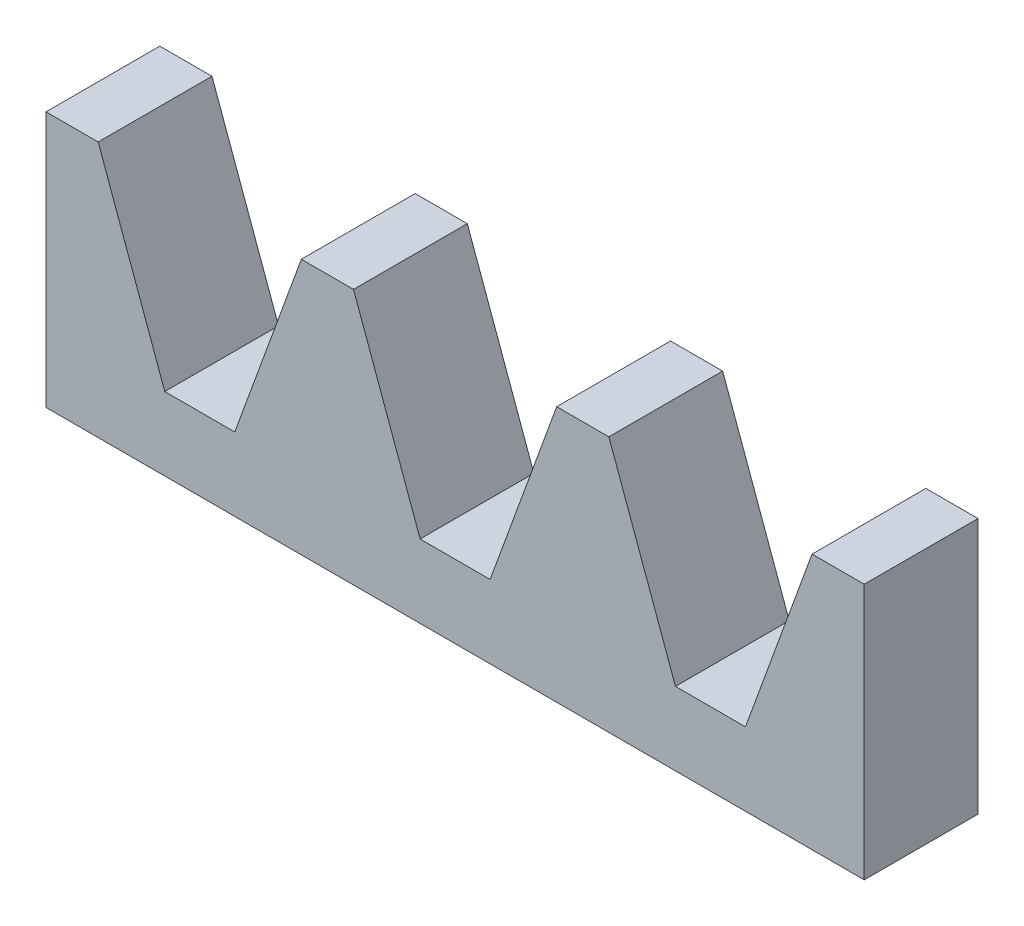
ISO-10303-21;
HEADER;
FILE_DESCRIPTION(('STEP AP214'),'2;1');
FILE_NAME('part.step','',(''),(''),'','','');
FILE_SCHEMA(('AUTOMOTIVE_DESIGN { 1 0 10303 214 1 1 1 1 }'));
ENDSEC;
DATA;
#1=APPLICATION_CONTEXT('core data for automotive mechanical design processes');
#2=APPLICATION_PROTOCOL_DEFINITION('international standard','automotive_design',2000,#1);
#3=PRODUCT_CONTEXT('',#1,'mechanical');
#4=PRODUCT('Part','Part','',(#3));
#5=PRODUCT_RELATED_PRODUCT_CATEGORY('part','',(#4));
#6=PRODUCT_DEFINITION_FORMATION('','',#4);
#7=PRODUCT_DEFINITION_CONTEXT('part definition',#1,'design');
#8=PRODUCT_DEFINITION('design','',#6,#7);
#9=PRODUCT_DEFINITION_SHAPE('','',#8);
#10=(LENGTH_UNIT() NAMED_UNIT(*) SI_UNIT(.MILLI.,.METRE.));
#11=(NAMED_UNIT(*) PLANE_ANGLE_UNIT() SI_UNIT($,.RADIAN.));
#12=(NAMED_UNIT(*) SI_UNIT($,.STERADIAN.) SOLID_ANGLE_UNIT());
#13=UNCERTAINTY_MEASURE_WITH_UNIT(LENGTH_MEASURE(1.E-05),#10,'distance_accuracy_value','');
#14=(GEOMETRIC_REPRESENTATION_CONTEXT(3) GLOBAL_UNCERTAINTY_ASSIGNED_CONTEXT((#13)) GLOBAL_UNIT_ASSIGNED_CONTEXT((#10,
#11,#12)) REPRESENTATION_CONTEXT('',''));
#15=CARTESIAN_POINT('',(0.,0.,0.));
#16=DIRECTION('',(0.,0.,1.));
#17=DIRECTION('',(1.,0.,0.));
#18=AXIS2_PLACEMENT_3D('',#15,#16,#17);
#19=CARTESIAN_POINT('',(0.,6.3,-2.8));
#20=DIRECTION('',(0.,1.,0.));
#21=DIRECTION('',(0.,0.,1.));
#22=AXIS2_PLACEMENT_3D('',#19,#20,#21);
#23=PLANE('',#22);
#24=DIRECTION('',(0.,0.,1.));
#25=VECTOR('',#24,1.);
#26=CARTESIAN_POINT('',(16.3498191064676,6.3,-2.8));
#27=LINE('',#26,#25);
#28=CARTESIAN_POINT('',(16.3498191064676,6.3,-2.8));
#29=VERTEX_POINT('',#28);
#30=CARTESIAN_POINT('',(16.3498191064676,6.3,0.));
#31=VERTEX_POINT('',#30);
#32=EDGE_CURVE('E254',#29,#31,#27,.T.);
#33=ORIENTED_EDGE('',*,*,#32,.F.);
#34=DIRECTION('',(-1.,0.,0.));
#35=VECTOR('',#34,1.);
#36=CARTESIAN_POINT('',(0.,6.3,-2.8));
#37=LINE('',#36,#35);
#38=CARTESIAN_POINT('',(15.0661073935324,6.3,-2.8));
#39=VERTEX_POINT('',#38);
#40=EDGE_CURVE('E184',#29,#39,#37,.T.);
#41=ORIENTED_EDGE('',*,*,#40,.T.);
#42=DIRECTION('',(0.,0.,-1.));
#43=VECTOR('',#42,1.);
#44=CARTESIAN_POINT('',(15.0661073935324,6.3,-2.8));
#45=LINE('',#44,#43);
#46=CARTESIAN_POINT('',(15.0661073935324,6.3,0.));
#47=VERTEX_POINT('',#46);
#48=EDGE_CURVE('E242',#47,#39,#45,.T.);
#49=ORIENTED_EDGE('',*,*,#48,.F.);
#50=DIRECTION('',(-1.,0.,0.));
#51=VECTOR('',#50,1.);
#52=CARTESIAN_POINT('',(0.,6.3,0.));
#53=LINE('',#52,#51);
#54=EDGE_CURVE('E176',#31,#47,#53,.T.);
#55=ORIENTED_EDGE('',*,*,#54,.F.);
#56=EDGE_LOOP('',(#33,#41,#49,#55));
#57=FACE_BOUND('',#56,.T.);
#58=ADVANCED_FACE('F32',(#57),#23,.T.);
#59=DIRECTION('',(0.,0.,1.));
#60=VECTOR('',#59,1.);
#61=CARTESIAN_POINT('',(10.0666338064676,6.3,-2.8));
#62=LINE('',#61,#60);
#63=CARTESIAN_POINT('',(10.0666338064676,6.3,-2.8));
#64=VERTEX_POINT('',#63);
#65=CARTESIAN_POINT('',(10.0666338064676,6.3,0.));
#66=VERTEX_POINT('',#65);
#67=EDGE_CURVE('E203',#64,#66,#62,.T.);
#68=ORIENTED_EDGE('',*,*,#67,.F.);
#69=CARTESIAN_POINT('',(8.78292209353239,6.3,-2.8));
#70=VERTEX_POINT('',#69);
#71=EDGE_CURVE('E174',#64,#70,#37,.T.);
#72=ORIENTED_EDGE('',*,*,#71,.T.);
#73=DIRECTION('',(0.,0.,-1.));
#74=VECTOR('',#73,1.);
#75=CARTESIAN_POINT('',(8.78292209353239,6.3,-2.8));
#76=LINE('',#75,#74);
#77=CARTESIAN_POINT('',(8.78292209353239,6.3,0.));
#78=VERTEX_POINT('',#77);
#79=EDGE_CURVE('E206',#78,#70,#76,.T.);
#80=ORIENTED_EDGE('',*,*,#79,.F.);
#81=EDGE_CURVE('E194',#66,#78,#53,.T.);
#82=ORIENTED_EDGE('',*,*,#81,.F.);
#83=EDGE_LOOP('',(#68,#72,#80,#82));
#84=FACE_BOUND('',#83,.T.);
#85=ADVANCED_FACE('F202',(#84),#23,.T.);
#86=DIRECTION('',(0.,0.,1.));
#87=VECTOR('',#86,1.);
#88=CARTESIAN_POINT('',(3.78344850646761,6.3,-2.8));
#89=LINE('',#88,#87);
#90=CARTESIAN_POINT('',(3.78344850646761,6.3,-2.8));
#91=VERTEX_POINT('',#90);
#92=CARTESIAN_POINT('',(3.78344850646761,6.3,0.));
#93=VERTEX_POINT('',#92);
#94=EDGE_CURVE('E219',#91,#93,#89,.T.);
#95=ORIENTED_EDGE('',*,*,#94,.F.);
#96=CARTESIAN_POINT('',(2.49973679353239,6.3,-2.8));
#97=VERTEX_POINT('',#96);
#98=EDGE_CURVE('E170',#91,#97,#37,.T.);
#99=ORIENTED_EDGE('',*,*,#98,.T.);
#100=DIRECTION('',(0.,0.,-1.));
#101=VECTOR('',#100,1.);
#102=CARTESIAN_POINT('',(2.49973679353239,6.3,-2.8));
#103=LINE('',#102,#101);
#104=CARTESIAN_POINT('',(2.49973679353239,6.3,0.));
#105=VERTEX_POINT('',#104);
#106=EDGE_CURVE('E180',#105,#97,#103,.T.);
#107=ORIENTED_EDGE('',*,*,#106,.F.);
#108=EDGE_CURVE('E178',#93,#105,#53,.T.);
#109=ORIENTED_EDGE('',*,*,#108,.F.);
#110=EDGE_LOOP('',(#95,#99,#107,#109));
#111=FACE_BOUND('',#110,.T.);
#112=ADVANCED_FACE('F216',(#111),#23,.T.);
#113=DIRECTION('',(0.,0.,1.));
#114=VECTOR('',#113,1.);
#115=CARTESIAN_POINT('',(22.6330044064676,6.3,-2.8));
#116=LINE('',#115,#114);
#117=CARTESIAN_POINT('',(22.6330044064676,6.3,-2.8));
#118=VERTEX_POINT('',#117);
#119=CARTESIAN_POINT('',(22.6330044064676,6.3,0.));
#120=VERTEX_POINT('',#119);
#121=EDGE_CURVE('E157',#118,#120,#116,.T.);
#122=ORIENTED_EDGE('',*,*,#121,.F.);
#123=CARTESIAN_POINT('',(21.3492926935324,6.3,-2.8));
#124=VERTEX_POINT('',#123);
#125=EDGE_CURVE('E166',#118,#124,#37,.T.);
#126=ORIENTED_EDGE('',*,*,#125,.T.);
#127=DIRECTION('',(0.,0.,-1.));
#128=VECTOR('',#127,1.);
#129=CARTESIAN_POINT('',(21.3492926935324,6.3,-2.8));
#130=LINE('',#129,#128);
#131=CARTESIAN_POINT('',(21.3492926935324,6.3,0.));
#132=VERTEX_POINT('',#131);
#133=EDGE_CURVE('E263',#132,#124,#130,.T.);
#134=ORIENTED_EDGE('',*,*,#133,.F.);
#135=EDGE_CURVE('E171',#120,#132,#53,.T.);
#136=ORIENTED_EDGE('',*,*,#135,.F.);
#137=EDGE_LOOP('',(#122,#126,#134,#136));
#138=FACE_BOUND('',#137,.T.);
#139=ADVANCED_FACE('F298',(#138),#23,.T.);
#140=CARTESIAN_POINT('',(0.,0.,-2.8));
#141=DIRECTION('',(0.,-1.,0.));
#142=DIRECTION('',(0.,0.,-1.));
#143=AXIS2_PLACEMENT_3D('',#140,#141,#142);
#144=PLANE('',#143);
#145=DIRECTION('',(0.,0.,1.));
#146=VECTOR('',#145,1.);
#147=CARTESIAN_POINT('',(22.6330044064676,0.,-2.8));
#148=LINE('',#147,#146);
#149=CARTESIAN_POINT('',(22.6330044064676,0.,-2.8));
#150=VERTEX_POINT('',#149);
#151=CARTESIAN_POINT('',(22.6330044064676,0.,0.));
#152=VERTEX_POINT('',#151);
#153=EDGE_CURVE('E146',#150,#152,#148,.T.);
#154=ORIENTED_EDGE('',*,*,#153,.T.);
#155=DIRECTION('',(1.,0.,0.));
#156=VECTOR('',#155,1.);
#157=CARTESIAN_POINT('',(0.,0.,0.));
#158=LINE('',#157,#156);
#159=CARTESIAN_POINT('',(2.49973679353239,0.,0.));
#160=VERTEX_POINT('',#159);
#161=EDGE_CURVE('E185',#160,#152,#158,.T.);
#162=ORIENTED_EDGE('',*,*,#161,.F.);
#163=DIRECTION('',(0.,0.,1.));
#164=VECTOR('',#163,1.);
#165=CARTESIAN_POINT('',(2.49973679353239,0.,-2.8));
#166=LINE('',#165,#164);
#167=CARTESIAN_POINT('',(2.49973679353239,0.,-2.8));
#168=VERTEX_POINT('',#167);
#169=EDGE_CURVE('E169',#168,#160,#166,.T.);
#170=ORIENTED_EDGE('',*,*,#169,.F.);
#171=DIRECTION('',(1.,0.,0.));
#172=VECTOR('',#171,1.);
#173=CARTESIAN_POINT('',(0.,0.,-2.8));
#174=LINE('',#173,#172);
#175=EDGE_CURVE('E164',#168,#150,#174,.T.);
#176=ORIENTED_EDGE('',*,*,#175,.T.);
#177=EDGE_LOOP('',(#154,#162,#170,#176));
#178=FACE_BOUND('',#177,.T.);
#179=ADVANCED_FACE('F34',(#178),#144,.T.);
#180=CARTESIAN_POINT('',(0.,6.3,-2.8));
#181=DIRECTION('',(0.,0.,-1.));
#182=DIRECTION('',(-1.,0.,0.));
#183=AXIS2_PLACEMENT_3D('',#180,#181,#182);
#184=PLANE('',#183);
#185=DIRECTION('',(0.,-1.,0.));
#186=VECTOR('',#185,1.);
#187=CARTESIAN_POINT('',(22.6330044064676,6.3,-2.8));
#188=LINE('',#187,#186);
#189=EDGE_CURVE('E149',#118,#150,#188,.T.);
#190=ORIENTED_EDGE('',*,*,#189,.T.);
#191=ORIENTED_EDGE('',*,*,#175,.F.);
#192=DIRECTION('',(0.,1.,0.));
#193=VECTOR('',#192,1.);
#194=CARTESIAN_POINT('',(2.49973679353239,0.,-2.8));
#195=LINE('',#194,#193);
#196=EDGE_CURVE('E284',#168,#97,#195,.T.);
#197=ORIENTED_EDGE('',*,*,#196,.T.);
#198=ORIENTED_EDGE('',*,*,#98,.F.);
#199=DIRECTION('',(0.342020143325663,-0.93969262078591,0.));
#200=VECTOR('',#199,1.);
#201=CARTESIAN_POINT('',(3.77420366251725,6.3254,-2.8));
#202=LINE('',#201,#200);
#203=CARTESIAN_POINT('',(5.42131456066549,1.8,-2.8));
#204=VERTEX_POINT('',#203);
#205=EDGE_CURVE('E230',#91,#204,#202,.T.);
#206=ORIENTED_EDGE('',*,*,#205,.T.);
#207=DIRECTION('',(1.,0.,0.));
#208=VECTOR('',#207,1.);
#209=CARTESIAN_POINT('',(7.14505603933451,1.8,-2.8));
#210=LINE('',#209,#208);
#211=CARTESIAN_POINT('',(7.14505603933451,1.8,-2.8));
#212=VERTEX_POINT('',#211);
#213=EDGE_CURVE('E236',#204,#212,#210,.T.);
#214=ORIENTED_EDGE('',*,*,#213,.T.);
#215=DIRECTION('',(0.342020143325663,0.93969262078591,0.));
#216=VECTOR('',#215,1.);
#217=CARTESIAN_POINT('',(8.79216693748275,6.3254,-2.8));
#218=LINE('',#217,#216);
#219=EDGE_CURVE('E226',#212,#70,#218,.T.);
#220=ORIENTED_EDGE('',*,*,#219,.T.);
#221=ORIENTED_EDGE('',*,*,#71,.F.);
#222=DIRECTION('',(0.342020143325663,-0.93969262078591,0.));
#223=VECTOR('',#222,1.);
#224=CARTESIAN_POINT('',(10.0573889625173,6.3254,-2.8));
#225=LINE('',#224,#223);
#226=CARTESIAN_POINT('',(11.7044998606655,1.8,-2.8));
#227=VERTEX_POINT('',#226);
#228=EDGE_CURVE('E252',#64,#227,#225,.T.);
#229=ORIENTED_EDGE('',*,*,#228,.T.);
#230=DIRECTION('',(1.,0.,0.));
#231=VECTOR('',#230,1.);
#232=CARTESIAN_POINT('',(13.4282413393345,1.8,-2.8));
#233=LINE('',#232,#231);
#234=CARTESIAN_POINT('',(13.4282413393345,1.8,-2.8));
#235=VERTEX_POINT('',#234);
#236=EDGE_CURVE('E257',#227,#235,#233,.T.);
#237=ORIENTED_EDGE('',*,*,#236,.T.);
#238=DIRECTION('',(0.342020143325663,0.93969262078591,0.));
#239=VECTOR('',#238,1.);
#240=CARTESIAN_POINT('',(15.0753522374828,6.3254,-2.8));
#241=LINE('',#240,#239);
#242=EDGE_CURVE('E247',#235,#39,#241,.T.);
#243=ORIENTED_EDGE('',*,*,#242,.T.);
#244=ORIENTED_EDGE('',*,*,#40,.F.);
#245=DIRECTION('',(0.342020143325663,-0.93969262078591,0.));
#246=VECTOR('',#245,1.);
#247=CARTESIAN_POINT('',(16.3405742625173,6.3254,-2.8));
#248=LINE('',#247,#246);
#249=CARTESIAN_POINT('',(17.9876851606655,1.8,-2.8));
#250=VERTEX_POINT('',#249);
#251=EDGE_CURVE('E273',#29,#250,#248,.T.);
#252=ORIENTED_EDGE('',*,*,#251,.T.);
#253=DIRECTION('',(1.,0.,0.));
#254=VECTOR('',#253,1.);
#255=CARTESIAN_POINT('',(19.7114266393345,1.8,-2.8));
#256=LINE('',#255,#254);
#257=CARTESIAN_POINT('',(19.7114266393345,1.8,-2.8));
#258=VERTEX_POINT('',#257);
#259=EDGE_CURVE('E277',#250,#258,#256,.T.);
#260=ORIENTED_EDGE('',*,*,#259,.T.);
#261=DIRECTION('',(0.342020143325663,0.93969262078591,0.));
#262=VECTOR('',#261,1.);
#263=CARTESIAN_POINT('',(21.3585375374828,6.3254,-2.8));
#264=LINE('',#263,#262);
#265=EDGE_CURVE('E268',#258,#124,#264,.T.);
#266=ORIENTED_EDGE('',*,*,#265,.T.);
#267=ORIENTED_EDGE('',*,*,#125,.F.);
#268=EDGE_LOOP('',(#190,#191,#197,#198,#206,#214,#220,#221,#229,#237,#243,#244,#252,#260,#266,#267));
#269=FACE_BOUND('',#268,.T.);
#270=ADVANCED_FACE('F162',(#269),#184,.T.);
#271=CARTESIAN_POINT('',(0.,6.3,0.));
#272=DIRECTION('',(0.,0.,-1.));
#273=DIRECTION('',(-1.,0.,0.));
#274=AXIS2_PLACEMENT_3D('',#271,#272,#273);
#275=PLANE('',#274);
#276=ORIENTED_EDGE('',*,*,#161,.T.);
#277=DIRECTION('',(0.,-1.,0.));
#278=VECTOR('',#277,1.);
#279=CARTESIAN_POINT('',(22.6330044064676,6.3,0.));
#280=LINE('',#279,#278);
#281=EDGE_CURVE('E152',#120,#152,#280,.T.);
#282=ORIENTED_EDGE('',*,*,#281,.F.);
#283=ORIENTED_EDGE('',*,*,#135,.T.);
#284=DIRECTION('',(0.342020143325663,0.93969262078591,0.));
#285=VECTOR('',#284,1.);
#286=CARTESIAN_POINT('',(21.3585375374828,6.3254,0.));
#287=LINE('',#286,#285);
#288=CARTESIAN_POINT('',(19.7114266393345,1.8,0.));
#289=VERTEX_POINT('',#288);
#290=EDGE_CURVE('E270',#289,#132,#287,.T.);
#291=ORIENTED_EDGE('',*,*,#290,.F.);
#292=DIRECTION('',(1.,0.,0.));
#293=VECTOR('',#292,1.);
#294=CARTESIAN_POINT('',(19.7114266393345,1.8,0.));
#295=LINE('',#294,#293);
#296=CARTESIAN_POINT('',(17.9876851606655,1.8,0.));
#297=VERTEX_POINT('',#296);
#298=EDGE_CURVE('E274',#297,#289,#295,.T.);
#299=ORIENTED_EDGE('',*,*,#298,.F.);
#300=DIRECTION('',(-0.342020143325663,0.939692620785911,0.));
#301=VECTOR('',#300,1.);
#302=CARTESIAN_POINT('',(14.4372535894889,11.5547305711267,0.));
#303=LINE('',#302,#301);
#304=EDGE_CURVE('E11',#297,#31,#303,.T.);
#305=ORIENTED_EDGE('',*,*,#304,.T.);
#306=ORIENTED_EDGE('',*,*,#54,.T.);
#307=DIRECTION('',(0.342020143325663,0.93969262078591,0.));
#308=VECTOR('',#307,1.);
#309=CARTESIAN_POINT('',(15.0753522374828,6.3254,0.));
#310=LINE('',#309,#308);
#311=CARTESIAN_POINT('',(13.4282413393345,1.8,0.));
#312=VERTEX_POINT('',#311);
#313=EDGE_CURVE('E249',#312,#47,#310,.T.);
#314=ORIENTED_EDGE('',*,*,#313,.F.);
#315=DIRECTION('',(1.,0.,0.));
#316=VECTOR('',#315,1.);
#317=CARTESIAN_POINT('',(13.4282413393345,1.8,0.));
#318=LINE('',#317,#316);
#319=CARTESIAN_POINT('',(11.7044998606655,1.8,0.));
#320=VERTEX_POINT('',#319);
#321=EDGE_CURVE('E197',#320,#312,#318,.T.);
#322=ORIENTED_EDGE('',*,*,#321,.F.);
#323=DIRECTION('',(-0.342020143325663,0.939692620785911,0.));
#324=VECTOR('',#323,1.);
#325=CARTESIAN_POINT('',(8.88906134741293,9.53535374102447,0.));
#326=LINE('',#325,#324);
#327=EDGE_CURVE('E40',#320,#66,#326,.T.);
#328=ORIENTED_EDGE('',*,*,#327,.T.);
#329=ORIENTED_EDGE('',*,*,#81,.T.);
#330=DIRECTION('',(0.342020143325663,0.93969262078591,0.));
#331=VECTOR('',#330,1.);
#332=CARTESIAN_POINT('',(8.79216693748275,6.3254,0.));
#333=LINE('',#332,#331);
#334=CARTESIAN_POINT('',(7.14505603933451,1.8,0.));
#335=VERTEX_POINT('',#334);
#336=EDGE_CURVE('E228',#335,#78,#333,.T.);
#337=ORIENTED_EDGE('',*,*,#336,.F.);
#338=DIRECTION('',(1.,0.,0.));
#339=VECTOR('',#338,1.);
#340=CARTESIAN_POINT('',(7.14505603933451,1.8,0.));
#341=LINE('',#340,#339);
#342=CARTESIAN_POINT('',(5.42131456066549,1.8,0.));
#343=VERTEX_POINT('',#342);
#344=EDGE_CURVE('E231',#343,#335,#341,.T.);
#345=ORIENTED_EDGE('',*,*,#344,.F.);
#346=DIRECTION('',(-0.342020143325663,0.939692620785911,0.));
#347=VECTOR('',#346,1.);
#348=CARTESIAN_POINT('',(3.34086910533698,7.51597691092219,0.));
#349=LINE('',#348,#347);
#350=EDGE_CURVE('E183',#343,#93,#349,.T.);
#351=ORIENTED_EDGE('',*,*,#350,.T.);
#352=ORIENTED_EDGE('',*,*,#108,.T.);
#353=DIRECTION('',(0.,1.,0.));
#354=VECTOR('',#353,1.);
#355=CARTESIAN_POINT('',(2.49973679353239,0.,0.));
#356=LINE('',#355,#354);
#357=EDGE_CURVE('E211',#160,#105,#356,.T.);
#358=ORIENTED_EDGE('',*,*,#357,.F.);
#359=EDGE_LOOP('',(#276,#282,#283,#291,#299,#305,#306,#314,#322,#328,#329,#337,#345,#351,#352,#358));
#360=FACE_BOUND('',#359,.T.);
#361=ADVANCED_FACE('F192',(#360),#275,.F.);
#362=CARTESIAN_POINT('',(3.77420366251725,6.3254,-2.8));
#363=DIRECTION('',(-0.939692620785911,-0.342020143325663,0.));
#364=DIRECTION('',(0.342020143325663,-0.939692620785911,0.));
#365=AXIS2_PLACEMENT_3D('',#362,#363,#364);
#366=PLANE('',#365);
#367=ORIENTED_EDGE('',*,*,#94,.T.);
#368=ORIENTED_EDGE('',*,*,#350,.F.);
#369=DIRECTION('',(0.,0.,1.));
#370=VECTOR('',#369,1.);
#371=CARTESIAN_POINT('',(5.42131456066549,1.8,-2.8));
#372=LINE('',#371,#370);
#373=EDGE_CURVE('E224',#204,#343,#372,.T.);
#374=ORIENTED_EDGE('',*,*,#373,.F.);
#375=ORIENTED_EDGE('',*,*,#205,.F.);
#376=EDGE_LOOP('',(#367,#368,#374,#375));
#377=FACE_BOUND('',#376,.T.);
#378=ADVANCED_FACE('F342',(#377),#366,.F.);
#379=CARTESIAN_POINT('',(8.79216693748275,6.3254,-2.8));
#380=DIRECTION('',(0.939692620785911,-0.342020143325663,0.));
#381=DIRECTION('',(0.342020143325663,0.939692620785911,0.));
#382=AXIS2_PLACEMENT_3D('',#379,#380,#381);
#383=PLANE('',#382);
#384=ORIENTED_EDGE('',*,*,#79,.T.);
#385=ORIENTED_EDGE('',*,*,#219,.F.);
#386=DIRECTION('',(0.,0.,1.));
#387=VECTOR('',#386,1.);
#388=CARTESIAN_POINT('',(7.14505603933451,1.8,-2.8));
#389=LINE('',#388,#387);
#390=EDGE_CURVE('E221',#212,#335,#389,.T.);
#391=ORIENTED_EDGE('',*,*,#390,.T.);
#392=ORIENTED_EDGE('',*,*,#336,.T.);
#393=EDGE_LOOP('',(#384,#385,#391,#392));
#394=FACE_BOUND('',#393,.T.);
#395=ADVANCED_FACE('F339',(#394),#383,.F.);
#396=CARTESIAN_POINT('',(7.14505603933451,1.8,-2.8));
#397=DIRECTION('',(0.,-1.,0.));
#398=DIRECTION('',(0.,0.,-1.));
#399=AXIS2_PLACEMENT_3D('',#396,#397,#398);
#400=PLANE('',#399);
#401=ORIENTED_EDGE('',*,*,#344,.T.);
#402=ORIENTED_EDGE('',*,*,#390,.F.);
#403=ORIENTED_EDGE('',*,*,#213,.F.);
#404=ORIENTED_EDGE('',*,*,#373,.T.);
#405=EDGE_LOOP('',(#401,#402,#403,#404));
#406=FACE_BOUND('',#405,.T.);
#407=ADVANCED_FACE('F338',(#406),#400,.F.);
#408=CARTESIAN_POINT('',(10.0573889625173,6.3254,-2.8));
#409=DIRECTION('',(-0.939692620785911,-0.342020143325663,0.));
#410=DIRECTION('',(0.342020143325663,-0.939692620785911,0.));
#411=AXIS2_PLACEMENT_3D('',#408,#409,#410);
#412=PLANE('',#411);
#413=ORIENTED_EDGE('',*,*,#67,.T.);
#414=ORIENTED_EDGE('',*,*,#327,.F.);
#415=DIRECTION('',(0.,0.,1.));
#416=VECTOR('',#415,1.);
#417=CARTESIAN_POINT('',(11.7044998606655,1.8,-2.8));
#418=LINE('',#417,#416);
#419=EDGE_CURVE('E55',#227,#320,#418,.T.);
#420=ORIENTED_EDGE('',*,*,#419,.F.);
#421=ORIENTED_EDGE('',*,*,#228,.F.);
#422=EDGE_LOOP('',(#413,#414,#420,#421));
#423=FACE_BOUND('',#422,.T.);
#424=ADVANCED_FACE('F333',(#423),#412,.F.);
#425=CARTESIAN_POINT('',(15.0753522374828,6.3254,-2.8));
#426=DIRECTION('',(0.939692620785911,-0.342020143325663,0.));
#427=DIRECTION('',(0.342020143325663,0.939692620785911,0.));
#428=AXIS2_PLACEMENT_3D('',#425,#426,#427);
#429=PLANE('',#428);
#430=ORIENTED_EDGE('',*,*,#48,.T.);
#431=ORIENTED_EDGE('',*,*,#242,.F.);
#432=DIRECTION('',(0.,0.,1.));
#433=VECTOR('',#432,1.);
#434=CARTESIAN_POINT('',(13.4282413393345,1.8,-2.8));
#435=LINE('',#434,#433);
#436=EDGE_CURVE('E245',#235,#312,#435,.T.);
#437=ORIENTED_EDGE('',*,*,#436,.T.);
#438=ORIENTED_EDGE('',*,*,#313,.T.);
#439=EDGE_LOOP('',(#430,#431,#437,#438));
#440=FACE_BOUND('',#439,.T.);
#441=ADVANCED_FACE('F323',(#440),#429,.F.);
#442=CARTESIAN_POINT('',(13.4282413393345,1.8,-2.8));
#443=DIRECTION('',(0.,-1.,0.));
#444=DIRECTION('',(0.,0.,-1.));
#445=AXIS2_PLACEMENT_3D('',#442,#443,#444);
#446=PLANE('',#445);
#447=ORIENTED_EDGE('',*,*,#321,.T.);
#448=ORIENTED_EDGE('',*,*,#436,.F.);
#449=ORIENTED_EDGE('',*,*,#236,.F.);
#450=ORIENTED_EDGE('',*,*,#419,.T.);
#451=EDGE_LOOP('',(#447,#448,#449,#450));
#452=FACE_BOUND('',#451,.T.);
#453=ADVANCED_FACE('F324',(#452),#446,.F.);
#454=CARTESIAN_POINT('',(16.3405742625173,6.3254,-2.8));
#455=DIRECTION('',(-0.939692620785911,-0.342020143325663,0.));
#456=DIRECTION('',(0.342020143325663,-0.939692620785911,0.));
#457=AXIS2_PLACEMENT_3D('',#454,#455,#456);
#458=PLANE('',#457);
#459=ORIENTED_EDGE('',*,*,#32,.T.);
#460=ORIENTED_EDGE('',*,*,#304,.F.);
#461=DIRECTION('',(0.,0.,1.));
#462=VECTOR('',#461,1.);
#463=CARTESIAN_POINT('',(17.9876851606655,1.8,-2.8));
#464=LINE('',#463,#462);
#465=EDGE_CURVE('E47',#250,#297,#464,.T.);
#466=ORIENTED_EDGE('',*,*,#465,.F.);
#467=ORIENTED_EDGE('',*,*,#251,.F.);
#468=EDGE_LOOP('',(#459,#460,#466,#467));
#469=FACE_BOUND('',#468,.T.);
#470=ADVANCED_FACE('F326',(#469),#458,.F.);
#471=CARTESIAN_POINT('',(21.3585375374828,6.3254,-2.8));
#472=DIRECTION('',(0.939692620785911,-0.342020143325663,0.));
#473=DIRECTION('',(0.342020143325663,0.939692620785911,0.));
#474=AXIS2_PLACEMENT_3D('',#471,#472,#473);
#475=PLANE('',#474);
#476=ORIENTED_EDGE('',*,*,#133,.T.);
#477=ORIENTED_EDGE('',*,*,#265,.F.);
#478=DIRECTION('',(0.,0.,1.));
#479=VECTOR('',#478,1.);
#480=CARTESIAN_POINT('',(19.7114266393345,1.8,-2.8));
#481=LINE('',#480,#479);
#482=EDGE_CURVE('E266',#258,#289,#481,.T.);
#483=ORIENTED_EDGE('',*,*,#482,.T.);
#484=ORIENTED_EDGE('',*,*,#290,.T.);
#485=EDGE_LOOP('',(#476,#477,#483,#484));
#486=FACE_BOUND('',#485,.T.);
#487=ADVANCED_FACE('F315',(#486),#475,.F.);
#488=CARTESIAN_POINT('',(19.7114266393345,1.8,-2.8));
#489=DIRECTION('',(0.,-1.,0.));
#490=DIRECTION('',(0.,0.,-1.));
#491=AXIS2_PLACEMENT_3D('',#488,#489,#490);
#492=PLANE('',#491);
#493=ORIENTED_EDGE('',*,*,#298,.T.);
#494=ORIENTED_EDGE('',*,*,#482,.F.);
#495=ORIENTED_EDGE('',*,*,#259,.F.);
#496=ORIENTED_EDGE('',*,*,#465,.T.);
#497=EDGE_LOOP('',(#493,#494,#495,#496));
#498=FACE_BOUND('',#497,.T.);
#499=ADVANCED_FACE('F293',(#498),#492,.F.);
#500=CARTESIAN_POINT('',(22.6330044064676,6.3,-2.8));
#501=DIRECTION('',(-1.,0.,0.));
#502=DIRECTION('',(0.,0.,1.));
#503=AXIS2_PLACEMENT_3D('',#500,#501,#502);
#504=PLANE('',#503);
#505=ORIENTED_EDGE('',*,*,#281,.T.);
#506=ORIENTED_EDGE('',*,*,#153,.F.);
#507=ORIENTED_EDGE('',*,*,#189,.F.);
#508=ORIENTED_EDGE('',*,*,#121,.T.);
#509=EDGE_LOOP('',(#505,#506,#507,#508));
#510=FACE_BOUND('',#509,.T.);
#511=ADVANCED_FACE('F148',(#510),#504,.F.);
#512=CARTESIAN_POINT('',(2.49973679353239,0.,-2.8));
#513=DIRECTION('',(1.,0.,0.));
#514=DIRECTION('',(0.,0.,-1.));
#515=AXIS2_PLACEMENT_3D('',#512,#513,#514);
#516=PLANE('',#515);
#517=ORIENTED_EDGE('',*,*,#357,.T.);
#518=ORIENTED_EDGE('',*,*,#106,.T.);
#519=ORIENTED_EDGE('',*,*,#196,.F.);
#520=ORIENTED_EDGE('',*,*,#169,.T.);
#521=EDGE_LOOP('',(#517,#518,#519,#520));
#522=FACE_BOUND('',#521,.T.);
#523=ADVANCED_FACE('F287',(#522),#516,.F.);
#524=CLOSED_SHELL('',(#58,#85,#112,#139,#179,#270,#361,#378,#395,#407,#424,#441,#453,#470,#487,
#499,#511,#523));
#525=MANIFOLD_SOLID_BREP('B2',#524);
#526=ADVANCED_BREP_SHAPE_REPRESENTATION('',(#18,#525),#14);
#527=SHAPE_DEFINITION_REPRESENTATION(#9,#526);
ENDSEC;
END-ISO-10303-21;
